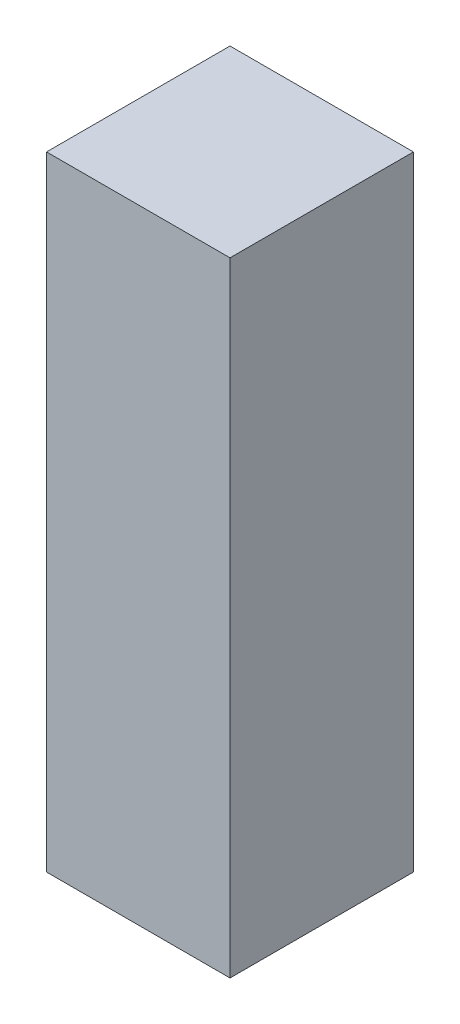
ISO-10303-21;
HEADER;
FILE_DESCRIPTION(('STEP AP214'),'2;1');
FILE_NAME('part.step','',(''),(''),'','','');
FILE_SCHEMA(('AUTOMOTIVE_DESIGN { 1 0 10303 214 1 1 1 1 }'));
ENDSEC;
DATA;
#1=APPLICATION_CONTEXT('core data for automotive mechanical design processes');
#2=APPLICATION_PROTOCOL_DEFINITION('international standard','automotive_design',2000,#1);
#3=PRODUCT_CONTEXT('',#1,'mechanical');
#4=PRODUCT('Part','Part','',(#3));
#5=PRODUCT_RELATED_PRODUCT_CATEGORY('part','',(#4));
#6=PRODUCT_DEFINITION_FORMATION('','',#4);
#7=PRODUCT_DEFINITION_CONTEXT('part definition',#1,'design');
#8=PRODUCT_DEFINITION('design','',#6,#7);
#9=PRODUCT_DEFINITION_SHAPE('','',#8);
#10=(LENGTH_UNIT() NAMED_UNIT(*) SI_UNIT(.MILLI.,.METRE.));
#11=(NAMED_UNIT(*) PLANE_ANGLE_UNIT() SI_UNIT($,.RADIAN.));
#12=(NAMED_UNIT(*) SI_UNIT($,.STERADIAN.) SOLID_ANGLE_UNIT());
#13=UNCERTAINTY_MEASURE_WITH_UNIT(LENGTH_MEASURE(1.E-05),#10,'distance_accuracy_value','');
#14=(GEOMETRIC_REPRESENTATION_CONTEXT(3) GLOBAL_UNCERTAINTY_ASSIGNED_CONTEXT((#13)) GLOBAL_UNIT_ASSIGNED_CONTEXT((#10,
#11,#12)) REPRESENTATION_CONTEXT('',''));
#15=CARTESIAN_POINT('',(0.,0.,0.));
#16=DIRECTION('',(0.,0.,1.));
#17=DIRECTION('',(1.,0.,0.));
#18=AXIS2_PLACEMENT_3D('',#15,#16,#17);
#19=CARTESIAN_POINT('',(15.,100.,15.));
#20=DIRECTION('',(-1.,0.,0.));
#21=DIRECTION('',(0.,0.,1.));
#22=AXIS2_PLACEMENT_3D('',#19,#20,#21);
#23=PLANE('',#22);
#24=DIRECTION('',(0.,-1.,0.));
#25=VECTOR('',#24,1.);
#26=CARTESIAN_POINT('',(15.,100.,15.));
#27=LINE('',#26,#25);
#28=CARTESIAN_POINT('',(15.,101.,15.));
#29=VERTEX_POINT('',#28);
#30=CARTESIAN_POINT('',(15.,-1.,15.));
#31=VERTEX_POINT('',#30);
#32=EDGE_CURVE('E194',#29,#31,#27,.T.);
#33=ORIENTED_EDGE('',*,*,#32,.T.);
#34=DIRECTION('',(0.,0.,1.));
#35=VECTOR('',#34,1.);
#36=CARTESIAN_POINT('',(15.,-1.,15.));
#37=LINE('',#36,#35);
#38=CARTESIAN_POINT('',(15.,-1.,-15.));
#39=VERTEX_POINT('',#38);
#40=EDGE_CURVE('E134',#39,#31,#37,.T.);
#41=ORIENTED_EDGE('',*,*,#40,.F.);
#42=DIRECTION('',(0.,-1.,0.));
#43=VECTOR('',#42,1.);
#44=CARTESIAN_POINT('',(15.,100.,-15.));
#45=LINE('',#44,#43);
#46=CARTESIAN_POINT('',(15.,101.,-15.));
#47=VERTEX_POINT('',#46);
#48=EDGE_CURVE('E11',#47,#39,#45,.T.);
#49=ORIENTED_EDGE('',*,*,#48,.F.);
#50=DIRECTION('',(0.,0.,-1.));
#51=VECTOR('',#50,1.);
#52=CARTESIAN_POINT('',(15.,101.,-15.));
#53=LINE('',#52,#51);
#54=EDGE_CURVE('E153',#29,#47,#53,.T.);
#55=ORIENTED_EDGE('',*,*,#54,.F.);
#56=EDGE_LOOP('',(#33,#41,#49,#55));
#57=FACE_BOUND('',#56,.T.);
#58=ADVANCED_FACE('F40',(#57),#23,.F.);
#59=CARTESIAN_POINT('',(-15.,100.,-15.));
#60=DIRECTION('',(0.,0.,1.));
#61=DIRECTION('',(1.,0.,0.));
#62=AXIS2_PLACEMENT_3D('',#59,#60,#61);
#63=PLANE('',#62);
#64=ORIENTED_EDGE('',*,*,#48,.T.);
#65=DIRECTION('',(1.,0.,0.));
#66=VECTOR('',#65,1.);
#67=CARTESIAN_POINT('',(-15.,-1.,-15.));
#68=LINE('',#67,#66);
#69=CARTESIAN_POINT('',(-15.,-1.,-15.));
#70=VERTEX_POINT('',#69);
#71=EDGE_CURVE('E128',#70,#39,#68,.T.);
#72=ORIENTED_EDGE('',*,*,#71,.F.);
#73=DIRECTION('',(0.,-1.,0.));
#74=VECTOR('',#73,1.);
#75=CARTESIAN_POINT('',(-15.,100.,-15.));
#76=LINE('',#75,#74);
#77=CARTESIAN_POINT('',(-15.,101.,-15.));
#78=VERTEX_POINT('',#77);
#79=EDGE_CURVE('E49',#78,#70,#76,.T.);
#80=ORIENTED_EDGE('',*,*,#79,.F.);
#81=DIRECTION('',(-1.,0.,0.));
#82=VECTOR('',#81,1.);
#83=CARTESIAN_POINT('',(-15.,101.,-15.));
#84=LINE('',#83,#82);
#85=EDGE_CURVE('E157',#47,#78,#84,.T.);
#86=ORIENTED_EDGE('',*,*,#85,.F.);
#87=EDGE_LOOP('',(#64,#72,#80,#86));
#88=FACE_BOUND('',#87,.T.);
#89=ADVANCED_FACE('F129',(#88),#63,.F.);
#90=CARTESIAN_POINT('',(-15.,100.,15.));
#91=DIRECTION('',(1.,0.,0.));
#92=DIRECTION('',(0.,0.,-1.));
#93=AXIS2_PLACEMENT_3D('',#90,#91,#92);
#94=PLANE('',#93);
#95=ORIENTED_EDGE('',*,*,#79,.T.);
#96=DIRECTION('',(0.,0.,-1.));
#97=VECTOR('',#96,1.);
#98=CARTESIAN_POINT('',(-15.,-1.,15.));
#99=LINE('',#98,#97);
#100=CARTESIAN_POINT('',(-15.,-1.,15.));
#101=VERTEX_POINT('',#100);
#102=EDGE_CURVE('E119',#101,#70,#99,.T.);
#103=ORIENTED_EDGE('',*,*,#102,.F.);
#104=DIRECTION('',(0.,-1.,0.));
#105=VECTOR('',#104,1.);
#106=CARTESIAN_POINT('',(-15.,100.,15.));
#107=LINE('',#106,#105);
#108=CARTESIAN_POINT('',(-15.,101.,15.));
#109=VERTEX_POINT('',#108);
#110=EDGE_CURVE('E126',#109,#101,#107,.T.);
#111=ORIENTED_EDGE('',*,*,#110,.F.);
#112=DIRECTION('',(0.,0.,1.));
#113=VECTOR('',#112,1.);
#114=CARTESIAN_POINT('',(-15.,101.,-15.));
#115=LINE('',#114,#113);
#116=EDGE_CURVE('E121',#78,#109,#115,.T.);
#117=ORIENTED_EDGE('',*,*,#116,.F.);
#118=EDGE_LOOP('',(#95,#103,#111,#117));
#119=FACE_BOUND('',#118,.T.);
#120=ADVANCED_FACE('F117',(#119),#94,.F.);
#121=CARTESIAN_POINT('',(-15.,100.,15.));
#122=DIRECTION('',(0.,0.,-1.));
#123=DIRECTION('',(-1.,0.,0.));
#124=AXIS2_PLACEMENT_3D('',#121,#122,#123);
#125=PLANE('',#124);
#126=ORIENTED_EDGE('',*,*,#110,.T.);
#127=DIRECTION('',(-1.,0.,0.));
#128=VECTOR('',#127,1.);
#129=CARTESIAN_POINT('',(-15.,-1.,15.));
#130=LINE('',#129,#128);
#131=EDGE_CURVE('E139',#31,#101,#130,.T.);
#132=ORIENTED_EDGE('',*,*,#131,.F.);
#133=ORIENTED_EDGE('',*,*,#32,.F.);
#134=DIRECTION('',(1.,0.,0.));
#135=VECTOR('',#134,1.);
#136=CARTESIAN_POINT('',(-15.,101.,15.));
#137=LINE('',#136,#135);
#138=EDGE_CURVE('E149',#109,#29,#137,.T.);
#139=ORIENTED_EDGE('',*,*,#138,.F.);
#140=EDGE_LOOP('',(#126,#132,#133,#139));
#141=FACE_BOUND('',#140,.T.);
#142=ADVANCED_FACE('F200',(#141),#125,.F.);
#143=CARTESIAN_POINT('',(0.,101.,0.));
#144=DIRECTION('',(0.,1.,0.));
#145=DIRECTION('',(0.,0.,1.));
#146=AXIS2_PLACEMENT_3D('',#143,#144,#145);
#147=PLANE('',#146);
#148=ORIENTED_EDGE('',*,*,#116,.T.);
#149=ORIENTED_EDGE('',*,*,#138,.T.);
#150=ORIENTED_EDGE('',*,*,#54,.T.);
#151=ORIENTED_EDGE('',*,*,#85,.T.);
#152=EDGE_LOOP('',(#148,#149,#150,#151));
#153=FACE_BOUND('',#152,.T.);
#154=ADVANCED_FACE('F203',(#153),#147,.T.);
#155=CARTESIAN_POINT('',(0.,-1.,0.));
#156=DIRECTION('',(0.,-1.,0.));
#157=DIRECTION('',(0.,0.,-1.));
#158=AXIS2_PLACEMENT_3D('',#155,#156,#157);
#159=PLANE('',#158);
#160=ORIENTED_EDGE('',*,*,#102,.T.);
#161=ORIENTED_EDGE('',*,*,#71,.T.);
#162=ORIENTED_EDGE('',*,*,#40,.T.);
#163=ORIENTED_EDGE('',*,*,#131,.T.);
#164=EDGE_LOOP('',(#160,#161,#162,#163));
#165=FACE_BOUND('',#164,.T.);
#166=ADVANCED_FACE('F137',(#165),#159,.T.);
#167=CLOSED_SHELL('',(#58,#89,#120,#142,#154,#166));
#168=CARTESIAN_POINT('',(0.,0.,0.));
#169=DIRECTION('',(0.,-1.,0.));
#170=DIRECTION('',(0.,0.,-1.));
#171=AXIS2_PLACEMENT_3D('',#168,#169,#170);
#172=PLANE('',#171);
#173=DIRECTION('',(0.,0.,-1.));
#174=VECTOR('',#173,1.);
#175=CARTESIAN_POINT('',(13.,0.,13.));
#176=LINE('',#175,#174);
#177=CARTESIAN_POINT('',(13.,0.,13.));
#178=VERTEX_POINT('',#177);
#179=CARTESIAN_POINT('',(13.,0.,-13.));
#180=VERTEX_POINT('',#179);
#181=EDGE_CURVE('E175',#178,#180,#176,.T.);
#182=ORIENTED_EDGE('',*,*,#181,.T.);
#183=DIRECTION('',(-1.,0.,0.));
#184=VECTOR('',#183,1.);
#185=CARTESIAN_POINT('',(-13.,0.,-13.));
#186=LINE('',#185,#184);
#187=CARTESIAN_POINT('',(-13.,0.,-13.));
#188=VERTEX_POINT('',#187);
#189=EDGE_CURVE('E163',#180,#188,#186,.T.);
#190=ORIENTED_EDGE('',*,*,#189,.T.);
#191=DIRECTION('',(0.,0.,1.));
#192=VECTOR('',#191,1.);
#193=CARTESIAN_POINT('',(-13.,0.,13.));
#194=LINE('',#193,#192);
#195=CARTESIAN_POINT('',(-13.,0.,13.));
#196=VERTEX_POINT('',#195);
#197=EDGE_CURVE('E56',#188,#196,#194,.T.);
#198=ORIENTED_EDGE('',*,*,#197,.T.);
#199=DIRECTION('',(1.,0.,0.));
#200=VECTOR('',#199,1.);
#201=CARTESIAN_POINT('',(-13.,0.,13.));
#202=LINE('',#201,#200);
#203=EDGE_CURVE('E77',#196,#178,#202,.T.);
#204=ORIENTED_EDGE('',*,*,#203,.T.);
#205=EDGE_LOOP('',(#182,#190,#198,#204));
#206=FACE_BOUND('',#205,.T.);
#207=ADVANCED_FACE('F235',(#206),#172,.F.);
#208=CARTESIAN_POINT('',(0.,100.,0.));
#209=DIRECTION('',(0.,1.,0.));
#210=DIRECTION('',(0.,0.,1.));
#211=AXIS2_PLACEMENT_3D('',#208,#209,#210);
#212=PLANE('',#211);
#213=DIRECTION('',(0.,0.,1.));
#214=VECTOR('',#213,1.);
#215=CARTESIAN_POINT('',(-13.,100.,13.));
#216=LINE('',#215,#214);
#217=CARTESIAN_POINT('',(-13.,100.,-13.));
#218=VERTEX_POINT('',#217);
#219=CARTESIAN_POINT('',(-13.,100.,13.));
#220=VERTEX_POINT('',#219);
#221=EDGE_CURVE('E81',#218,#220,#216,.T.);
#222=ORIENTED_EDGE('',*,*,#221,.F.);
#223=DIRECTION('',(-1.,0.,0.));
#224=VECTOR('',#223,1.);
#225=CARTESIAN_POINT('',(-13.,100.,-13.));
#226=LINE('',#225,#224);
#227=CARTESIAN_POINT('',(13.,100.,-13.));
#228=VERTEX_POINT('',#227);
#229=EDGE_CURVE('E84',#228,#218,#226,.T.);
#230=ORIENTED_EDGE('',*,*,#229,.F.);
#231=DIRECTION('',(0.,0.,-1.));
#232=VECTOR('',#231,1.);
#233=CARTESIAN_POINT('',(13.,100.,13.));
#234=LINE('',#233,#232);
#235=CARTESIAN_POINT('',(13.,100.,13.));
#236=VERTEX_POINT('',#235);
#237=EDGE_CURVE('E65',#236,#228,#234,.T.);
#238=ORIENTED_EDGE('',*,*,#237,.F.);
#239=DIRECTION('',(1.,0.,0.));
#240=VECTOR('',#239,1.);
#241=CARTESIAN_POINT('',(-13.,100.,13.));
#242=LINE('',#241,#240);
#243=EDGE_CURVE('E162',#220,#236,#242,.T.);
#244=ORIENTED_EDGE('',*,*,#243,.F.);
#245=EDGE_LOOP('',(#222,#230,#238,#244));
#246=FACE_BOUND('',#245,.T.);
#247=ADVANCED_FACE('F228',(#246),#212,.F.);
#248=CARTESIAN_POINT('',(13.,100.,13.));
#249=DIRECTION('',(-1.,0.,0.));
#250=DIRECTION('',(0.,0.,1.));
#251=AXIS2_PLACEMENT_3D('',#248,#249,#250);
#252=PLANE('',#251);
#253=ORIENTED_EDGE('',*,*,#181,.F.);
#254=DIRECTION('',(0.,-1.,0.));
#255=VECTOR('',#254,1.);
#256=CARTESIAN_POINT('',(13.,100.,13.));
#257=LINE('',#256,#255);
#258=EDGE_CURVE('E188',#236,#178,#257,.T.);
#259=ORIENTED_EDGE('',*,*,#258,.F.);
#260=ORIENTED_EDGE('',*,*,#237,.T.);
#261=DIRECTION('',(0.,-1.,0.));
#262=VECTOR('',#261,1.);
#263=CARTESIAN_POINT('',(13.,100.,-13.));
#264=LINE('',#263,#262);
#265=EDGE_CURVE('E184',#228,#180,#264,.T.);
#266=ORIENTED_EDGE('',*,*,#265,.T.);
#267=EDGE_LOOP('',(#253,#259,#260,#266));
#268=FACE_BOUND('',#267,.T.);
#269=ADVANCED_FACE('F225',(#268),#252,.T.);
#270=CARTESIAN_POINT('',(-13.,100.,13.));
#271=DIRECTION('',(0.,0.,-1.));
#272=DIRECTION('',(-1.,0.,0.));
#273=AXIS2_PLACEMENT_3D('',#270,#271,#272);
#274=PLANE('',#273);
#275=ORIENTED_EDGE('',*,*,#203,.F.);
#276=DIRECTION('',(0.,-1.,0.));
#277=VECTOR('',#276,1.);
#278=CARTESIAN_POINT('',(-13.,100.,13.));
#279=LINE('',#278,#277);
#280=EDGE_CURVE('E191',#220,#196,#279,.T.);
#281=ORIENTED_EDGE('',*,*,#280,.F.);
#282=ORIENTED_EDGE('',*,*,#243,.T.);
#283=ORIENTED_EDGE('',*,*,#258,.T.);
#284=EDGE_LOOP('',(#275,#281,#282,#283));
#285=FACE_BOUND('',#284,.T.);
#286=ADVANCED_FACE('F221',(#285),#274,.T.);
#287=CARTESIAN_POINT('',(-13.,100.,13.));
#288=DIRECTION('',(1.,0.,0.));
#289=DIRECTION('',(0.,0.,-1.));
#290=AXIS2_PLACEMENT_3D('',#287,#288,#289);
#291=PLANE('',#290);
#292=ORIENTED_EDGE('',*,*,#197,.F.);
#293=DIRECTION('',(0.,-1.,0.));
#294=VECTOR('',#293,1.);
#295=CARTESIAN_POINT('',(-13.,100.,-13.));
#296=LINE('',#295,#294);
#297=EDGE_CURVE('E170',#218,#188,#296,.T.);
#298=ORIENTED_EDGE('',*,*,#297,.F.);
#299=ORIENTED_EDGE('',*,*,#221,.T.);
#300=ORIENTED_EDGE('',*,*,#280,.T.);
#301=EDGE_LOOP('',(#292,#298,#299,#300));
#302=FACE_BOUND('',#301,.T.);
#303=ADVANCED_FACE('F217',(#302),#291,.T.);
#304=CARTESIAN_POINT('',(-13.,100.,-13.));
#305=DIRECTION('',(0.,0.,1.));
#306=DIRECTION('',(1.,0.,0.));
#307=AXIS2_PLACEMENT_3D('',#304,#305,#306);
#308=PLANE('',#307);
#309=ORIENTED_EDGE('',*,*,#189,.F.);
#310=ORIENTED_EDGE('',*,*,#265,.F.);
#311=ORIENTED_EDGE('',*,*,#229,.T.);
#312=ORIENTED_EDGE('',*,*,#297,.T.);
#313=EDGE_LOOP('',(#309,#310,#311,#312));
#314=FACE_BOUND('',#313,.T.);
#315=ADVANCED_FACE('F220',(#314),#308,.T.);
#316=CLOSED_SHELL('',(#207,#247,#269,#286,#303,#315));
#317=ORIENTED_CLOSED_SHELL('',*,#316,.T.);
#318=BREP_WITH_VOIDS('B2',#167,(#317));
#319=ADVANCED_BREP_SHAPE_REPRESENTATION('',(#18,#318),#14);
#320=SHAPE_DEFINITION_REPRESENTATION(#9,#319);
ENDSEC;
END-ISO-10303-21;
